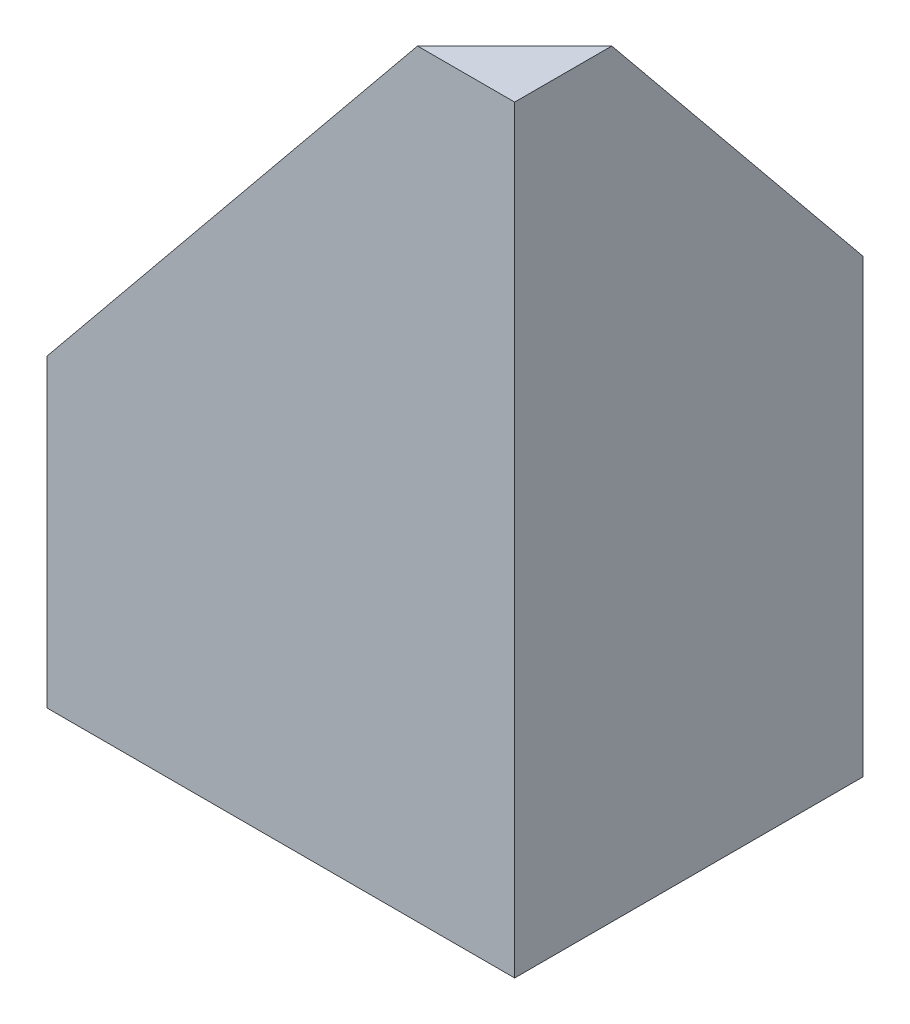
ISO-10303-21;
HEADER;
FILE_DESCRIPTION(('STEP AP214'),'2;1');
FILE_NAME('part.step','',(''),(''),'','','');
FILE_SCHEMA(('AUTOMOTIVE_DESIGN { 1 0 10303 214 1 1 1 1 }'));
ENDSEC;
DATA;
#1=APPLICATION_CONTEXT('core data for automotive mechanical design processes');
#2=APPLICATION_PROTOCOL_DEFINITION('international standard','automotive_design',2000,#1);
#3=PRODUCT_CONTEXT('',#1,'mechanical');
#4=PRODUCT('Part','Part','',(#3));
#5=PRODUCT_RELATED_PRODUCT_CATEGORY('part','',(#4));
#6=PRODUCT_DEFINITION_FORMATION('','',#4);
#7=PRODUCT_DEFINITION_CONTEXT('part definition',#1,'design');
#8=PRODUCT_DEFINITION('design','',#6,#7);
#9=PRODUCT_DEFINITION_SHAPE('','',#8);
#10=(LENGTH_UNIT() NAMED_UNIT(*) SI_UNIT(.MILLI.,.METRE.));
#11=(NAMED_UNIT(*) PLANE_ANGLE_UNIT() SI_UNIT($,.RADIAN.));
#12=(NAMED_UNIT(*) SI_UNIT($,.STERADIAN.) SOLID_ANGLE_UNIT());
#13=UNCERTAINTY_MEASURE_WITH_UNIT(LENGTH_MEASURE(1.E-05),#10,'distance_accuracy_value','');
#14=(GEOMETRIC_REPRESENTATION_CONTEXT(3) GLOBAL_UNCERTAINTY_ASSIGNED_CONTEXT((#13)) GLOBAL_UNIT_ASSIGNED_CONTEXT((#10,
#11,#12)) REPRESENTATION_CONTEXT('',''));
#15=CARTESIAN_POINT('',(0.,0.,0.));
#16=DIRECTION('',(0.,0.,1.));
#17=DIRECTION('',(1.,0.,0.));
#18=AXIS2_PLACEMENT_3D('',#15,#16,#17);
#19=CARTESIAN_POINT('',(28.,22.7,0.));
#20=DIRECTION('',(-1.,0.,0.));
#21=DIRECTION('',(0.,0.,-1.));
#22=AXIS2_PLACEMENT_3D('',#19,#20,#21);
#23=PLANE('',#22);
#24=DIRECTION('',(0.,1.,0.));
#25=VECTOR('',#24,1.);
#26=CARTESIAN_POINT('',(28.,22.7,-10.4294372515228));
#27=LINE('',#26,#25);
#28=CARTESIAN_POINT('',(28.,0.,-10.4294372515228));
#29=VERTEX_POINT('',#28);
#30=CARTESIAN_POINT('',(28.,13.4865214261848,-10.4294372515228));
#31=VERTEX_POINT('',#30);
#32=EDGE_CURVE('E88',#29,#31,#27,.T.);
#33=ORIENTED_EDGE('',*,*,#32,.T.);
#34=DIRECTION('',(0.,-0.77459666924148,-0.63245553203368));
#35=VECTOR('',#34,1.);
#36=CARTESIAN_POINT('',(28.,24.123968484595,-1.74399809853102));
#37=LINE('',#36,#35);
#38=CARTESIAN_POINT('',(28.,22.7,-2.90666349755173));
#39=VERTEX_POINT('',#38);
#40=EDGE_CURVE('E84',#39,#31,#37,.T.);
#41=ORIENTED_EDGE('',*,*,#40,.F.);
#42=DIRECTION('',(0.,0.,1.));
#43=VECTOR('',#42,1.);
#44=CARTESIAN_POINT('',(28.,22.7,0.));
#45=LINE('',#44,#43);
#46=CARTESIAN_POINT('',(28.,22.7,0.));
#47=VERTEX_POINT('',#46);
#48=EDGE_CURVE('E102',#39,#47,#45,.T.);
#49=ORIENTED_EDGE('',*,*,#48,.T.);
#50=DIRECTION('',(0.,-1.,0.));
#51=VECTOR('',#50,1.);
#52=CARTESIAN_POINT('',(28.,22.7,0.));
#53=LINE('',#52,#51);
#54=CARTESIAN_POINT('',(28.,0.,0.));
#55=VERTEX_POINT('',#54);
#56=EDGE_CURVE('E97',#47,#55,#53,.T.);
#57=ORIENTED_EDGE('',*,*,#56,.T.);
#58=DIRECTION('',(0.,0.,1.));
#59=VECTOR('',#58,1.);
#60=CARTESIAN_POINT('',(28.,0.,0.));
#61=LINE('',#60,#59);
#62=EDGE_CURVE('E103',#29,#55,#61,.T.);
#63=ORIENTED_EDGE('',*,*,#62,.F.);
#64=EDGE_LOOP('',(#33,#41,#49,#57,#63));
#65=FACE_BOUND('',#64,.T.);
#66=ADVANCED_FACE('F35',(#65),#23,.F.);
#67=CARTESIAN_POINT('',(28.,0.,0.));
#68=DIRECTION('',(0.,-1.,0.));
#69=DIRECTION('',(0.,0.,-1.));
#70=AXIS2_PLACEMENT_3D('',#67,#68,#69);
#71=PLANE('',#70);
#72=ORIENTED_EDGE('',*,*,#62,.T.);
#73=DIRECTION('',(-1.,0.,0.));
#74=VECTOR('',#73,1.);
#75=CARTESIAN_POINT('',(14.,0.,0.));
#76=LINE('',#75,#74);
#77=CARTESIAN_POINT('',(14.,0.,0.));
#78=VERTEX_POINT('',#77);
#79=EDGE_CURVE('E107',#55,#78,#76,.T.);
#80=ORIENTED_EDGE('',*,*,#79,.T.);
#81=DIRECTION('',(0.,0.,-1.));
#82=VECTOR('',#81,1.);
#83=CARTESIAN_POINT('',(14.,0.,-16.));
#84=LINE('',#83,#82);
#85=CARTESIAN_POINT('',(14.,0.,-7.44113588461134));
#86=VERTEX_POINT('',#85);
#87=EDGE_CURVE('E95',#78,#86,#84,.T.);
#88=ORIENTED_EDGE('',*,*,#87,.T.);
#89=DIRECTION('',(0.707106781186547,0.,-0.707106781186548));
#90=VECTOR('',#89,1.);
#91=CARTESIAN_POINT('',(17.2794320576943,0.,-10.7205679423057));
#92=LINE('',#91,#90);
#93=CARTESIAN_POINT('',(22.4941506834557,0.,-15.935286568067));
#94=VERTEX_POINT('',#93);
#95=EDGE_CURVE('E43',#86,#94,#92,.T.);
#96=ORIENTED_EDGE('',*,*,#95,.T.);
#97=DIRECTION('',(-0.707106781186548,0.,-0.707106781186547));
#98=VECTOR('',#97,1.);
#99=CARTESIAN_POINT('',(33.2147186257614,0.,-5.21471862576139));
#100=LINE('',#99,#98);
#101=EDGE_CURVE('E86',#29,#94,#100,.T.);
#102=ORIENTED_EDGE('',*,*,#101,.F.);
#103=EDGE_LOOP('',(#72,#80,#88,#96,#102));
#104=FACE_BOUND('',#103,.T.);
#105=ADVANCED_FACE('F93',(#104),#71,.T.);
#106=CARTESIAN_POINT('',(19.9595740432708,6.56498030287202,-8.04042595672921));
#107=DIRECTION('',(0.612372435695793,-0.500000000000005,0.612372435695793));
#108=DIRECTION('',(-0.707106781186547,0.,0.707106781186548));
#109=AXIS2_PLACEMENT_3D('',#106,#107,#108);
#110=PLANE('',#109);
#111=DIRECTION('',(-0.353553390593278,-0.866025403784436,-0.353553390593276));
#112=VECTOR('',#111,1.);
#113=CARTESIAN_POINT('',(25.1742926690322,6.56498030287201,-13.2551445824906));
#114=LINE('',#113,#112);
#115=EDGE_CURVE('E11',#31,#94,#114,.T.);
#116=ORIENTED_EDGE('',*,*,#115,.T.);
#117=ORIENTED_EDGE('',*,*,#95,.F.);
#118=DIRECTION('',(0.,0.77459666924148,0.632455532033681));
#119=VECTOR('',#118,1.);
#120=CARTESIAN_POINT('',(14.,9.42703002789595,0.256001901468801));
#121=LINE('',#120,#119);
#122=CARTESIAN_POINT('',(14.,9.11349301200554,0.));
#123=VERTEX_POINT('',#122);
#124=EDGE_CURVE('E56',#86,#123,#121,.T.);
#125=ORIENTED_EDGE('',*,*,#124,.T.);
#126=DIRECTION('',(0.632455532033681,0.774596669241479,0.));
#127=VECTOR('',#126,1.);
#128=CARTESIAN_POINT('',(20.6560019014689,17.2653972048021,0.));
#129=LINE('',#128,#127);
#130=CARTESIAN_POINT('',(25.0933365024483,22.7,0.));
#131=VERTEX_POINT('',#130);
#132=EDGE_CURVE('E115',#123,#131,#129,.T.);
#133=ORIENTED_EDGE('',*,*,#132,.T.);
#134=DIRECTION('',(0.707106781186547,0.,-0.707106781186548));
#135=VECTOR('',#134,1.);
#136=CARTESIAN_POINT('',(26.5466682512241,22.7,-1.45333174877587));
#137=LINE('',#136,#135);
#138=EDGE_CURVE('E113',#131,#39,#137,.T.);
#139=ORIENTED_EDGE('',*,*,#138,.T.);
#140=ORIENTED_EDGE('',*,*,#40,.T.);
#141=EDGE_LOOP('',(#116,#117,#125,#133,#139,#140));
#142=FACE_BOUND('',#141,.T.);
#143=ADVANCED_FACE('F80',(#142),#110,.F.);
#144=CARTESIAN_POINT('',(14.,22.7,0.));
#145=DIRECTION('',(0.,0.,-1.));
#146=DIRECTION('',(1.,0.,0.));
#147=AXIS2_PLACEMENT_3D('',#144,#145,#146);
#148=PLANE('',#147);
#149=DIRECTION('',(0.,-1.,0.));
#150=VECTOR('',#149,1.);
#151=CARTESIAN_POINT('',(14.,22.7,0.));
#152=LINE('',#151,#150);
#153=EDGE_CURVE('E96',#123,#78,#152,.T.);
#154=ORIENTED_EDGE('',*,*,#153,.T.);
#155=ORIENTED_EDGE('',*,*,#79,.F.);
#156=ORIENTED_EDGE('',*,*,#56,.F.);
#157=DIRECTION('',(-1.,0.,0.));
#158=VECTOR('',#157,1.);
#159=CARTESIAN_POINT('',(14.,22.7,0.));
#160=LINE('',#159,#158);
#161=EDGE_CURVE('E105',#47,#131,#160,.T.);
#162=ORIENTED_EDGE('',*,*,#161,.T.);
#163=ORIENTED_EDGE('',*,*,#132,.F.);
#164=EDGE_LOOP('',(#154,#155,#156,#162,#163));
#165=FACE_BOUND('',#164,.T.);
#166=ADVANCED_FACE('F37',(#165),#148,.F.);
#167=CARTESIAN_POINT('',(14.,22.7,-16.));
#168=DIRECTION('',(1.,0.,0.));
#169=DIRECTION('',(0.,0.,1.));
#170=AXIS2_PLACEMENT_3D('',#167,#168,#169);
#171=PLANE('',#170);
#172=ORIENTED_EDGE('',*,*,#87,.F.);
#173=ORIENTED_EDGE('',*,*,#153,.F.);
#174=ORIENTED_EDGE('',*,*,#124,.F.);
#175=EDGE_LOOP('',(#172,#173,#174));
#176=FACE_BOUND('',#175,.T.);
#177=ADVANCED_FACE('F123',(#176),#171,.F.);
#178=CARTESIAN_POINT('',(28.,22.7,0.));
#179=DIRECTION('',(0.,-1.,0.));
#180=DIRECTION('',(0.,0.,-1.));
#181=AXIS2_PLACEMENT_3D('',#178,#179,#180);
#182=PLANE('',#181);
#183=ORIENTED_EDGE('',*,*,#161,.F.);
#184=ORIENTED_EDGE('',*,*,#48,.F.);
#185=ORIENTED_EDGE('',*,*,#138,.F.);
#186=EDGE_LOOP('',(#183,#184,#185));
#187=FACE_BOUND('',#186,.T.);
#188=ADVANCED_FACE('F125',(#187),#182,.F.);
#189=CARTESIAN_POINT('',(33.2147186257614,0.,-5.21471862576139));
#190=DIRECTION('',(0.707106781186547,0.,-0.707106781186548));
#191=DIRECTION('',(0.707106781186548,0.,0.707106781186547));
#192=AXIS2_PLACEMENT_3D('',#189,#190,#191);
#193=PLANE('',#192);
#194=ORIENTED_EDGE('',*,*,#32,.F.);
#195=ORIENTED_EDGE('',*,*,#101,.T.);
#196=ORIENTED_EDGE('',*,*,#115,.F.);
#197=EDGE_LOOP('',(#194,#195,#196));
#198=FACE_BOUND('',#197,.T.);
#199=ADVANCED_FACE('F87',(#198),#193,.T.);
#200=CLOSED_SHELL('',(#66,#105,#143,#166,#177,#188,#199));
#201=MANIFOLD_SOLID_BREP('B2',#200);
#202=ADVANCED_BREP_SHAPE_REPRESENTATION('',(#18,#201),#14);
#203=SHAPE_DEFINITION_REPRESENTATION(#9,#202);
ENDSEC;
END-ISO-10303-21;
